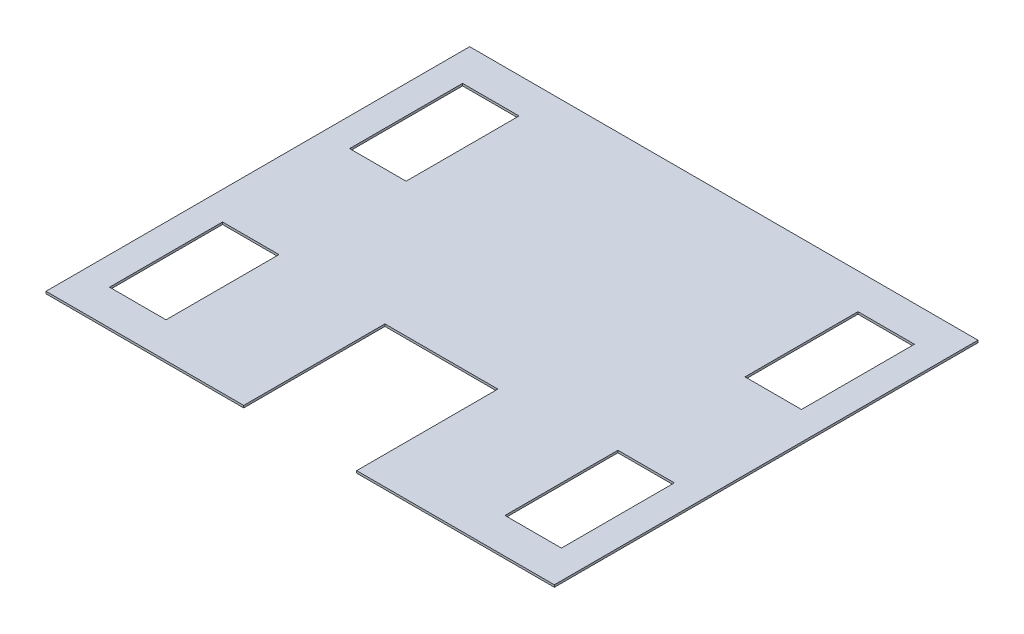
ISO-10303-21;
HEADER;
FILE_DESCRIPTION(('STEP AP214'),'2;1');
FILE_NAME('part.step','',(''),(''),'','','');
FILE_SCHEMA(('AUTOMOTIVE_DESIGN { 1 0 10303 214 1 1 1 1 }'));
ENDSEC;
DATA;
#1=APPLICATION_CONTEXT('core data for automotive mechanical design processes');
#2=APPLICATION_PROTOCOL_DEFINITION('international standard','automotive_design',2000,#1);
#3=PRODUCT_CONTEXT('',#1,'mechanical');
#4=PRODUCT('Part','Part','',(#3));
#5=PRODUCT_RELATED_PRODUCT_CATEGORY('part','',(#4));
#6=PRODUCT_DEFINITION_FORMATION('','',#4);
#7=PRODUCT_DEFINITION_CONTEXT('part definition',#1,'design');
#8=PRODUCT_DEFINITION('design','',#6,#7);
#9=PRODUCT_DEFINITION_SHAPE('','',#8);
#10=(LENGTH_UNIT() NAMED_UNIT(*) SI_UNIT(.MILLI.,.METRE.));
#11=(NAMED_UNIT(*) PLANE_ANGLE_UNIT() SI_UNIT($,.RADIAN.));
#12=(NAMED_UNIT(*) SI_UNIT($,.STERADIAN.) SOLID_ANGLE_UNIT());
#13=UNCERTAINTY_MEASURE_WITH_UNIT(LENGTH_MEASURE(1.E-05),#10,'distance_accuracy_value','');
#14=(GEOMETRIC_REPRESENTATION_CONTEXT(3) GLOBAL_UNCERTAINTY_ASSIGNED_CONTEXT((#13)) GLOBAL_UNIT_ASSIGNED_CONTEXT((#10,
#11,#12)) REPRESENTATION_CONTEXT('',''));
#15=CARTESIAN_POINT('',(0.,0.,0.));
#16=DIRECTION('',(0.,0.,1.));
#17=DIRECTION('',(1.,0.,0.));
#18=AXIS2_PLACEMENT_3D('',#15,#16,#17);
#19=CARTESIAN_POINT('',(-228.6,2.,190.5));
#20=DIRECTION('',(0.,0.,-1.));
#21=DIRECTION('',(-1.,0.,0.));
#22=AXIS2_PLACEMENT_3D('',#19,#20,#21);
#23=PLANE('',#22);
#24=DIRECTION('',(1.,0.,0.));
#25=VECTOR('',#24,1.);
#26=CARTESIAN_POINT('',(-228.6,0.,190.5));
#27=LINE('',#26,#25);
#28=CARTESIAN_POINT('',(-228.6,0.,190.5));
#29=VERTEX_POINT('',#28);
#30=CARTESIAN_POINT('',(-50.7999999999999,0.,190.5));
#31=VERTEX_POINT('',#30);
#32=EDGE_CURVE('E359',#29,#31,#27,.T.);
#33=ORIENTED_EDGE('',*,*,#32,.T.);
#34=DIRECTION('',(0.,1.,0.));
#35=VECTOR('',#34,1.);
#36=CARTESIAN_POINT('',(-50.7999999999999,0.,190.5));
#37=LINE('',#36,#35);
#38=CARTESIAN_POINT('',(-50.7999999999999,2.,190.5));
#39=VERTEX_POINT('',#38);
#40=EDGE_CURVE('E227',#31,#39,#37,.T.);
#41=ORIENTED_EDGE('',*,*,#40,.T.);
#42=DIRECTION('',(1.,0.,0.));
#43=VECTOR('',#42,1.);
#44=CARTESIAN_POINT('',(-228.6,2.,190.5));
#45=LINE('',#44,#43);
#46=CARTESIAN_POINT('',(-228.6,2.,190.5));
#47=VERTEX_POINT('',#46);
#48=EDGE_CURVE('E364',#47,#39,#45,.T.);
#49=ORIENTED_EDGE('',*,*,#48,.F.);
#50=DIRECTION('',(0.,-1.,0.));
#51=VECTOR('',#50,1.);
#52=CARTESIAN_POINT('',(-228.6,2.,190.5));
#53=LINE('',#52,#51);
#54=EDGE_CURVE('E378',#47,#29,#53,.T.);
#55=ORIENTED_EDGE('',*,*,#54,.T.);
#56=EDGE_LOOP('',(#33,#41,#49,#55));
#57=FACE_BOUND('',#56,.T.);
#58=ADVANCED_FACE('F34',(#57),#23,.F.);
#59=CARTESIAN_POINT('',(0.,2.,0.));
#60=DIRECTION('',(0.,1.,0.));
#61=DIRECTION('',(0.,0.,1.));
#62=AXIS2_PLACEMENT_3D('',#59,#60,#61);
#63=PLANE('',#62);
#64=DIRECTION('',(0.,0.,1.));
#65=VECTOR('',#64,1.);
#66=CARTESIAN_POINT('',(-50.7999999999999,2.,190.5));
#67=LINE('',#66,#65);
#68=CARTESIAN_POINT('',(-50.7999999999999,2.,63.5));
#69=VERTEX_POINT('',#68);
#70=EDGE_CURVE('E219',#69,#39,#67,.T.);
#71=ORIENTED_EDGE('',*,*,#70,.F.);
#72=DIRECTION('',(-1.,0.,0.));
#73=VECTOR('',#72,1.);
#74=CARTESIAN_POINT('',(-50.7999999999999,2.,63.5));
#75=LINE('',#74,#73);
#76=CARTESIAN_POINT('',(50.8000000000001,2.,63.5));
#77=VERTEX_POINT('',#76);
#78=EDGE_CURVE('E221',#77,#69,#75,.T.);
#79=ORIENTED_EDGE('',*,*,#78,.F.);
#80=DIRECTION('',(0.,0.,-1.));
#81=VECTOR('',#80,1.);
#82=CARTESIAN_POINT('',(50.8000000000001,2.,63.5));
#83=LINE('',#82,#81);
#84=CARTESIAN_POINT('',(50.8000000000001,2.,190.5));
#85=VERTEX_POINT('',#84);
#86=EDGE_CURVE('E199',#85,#77,#83,.T.);
#87=ORIENTED_EDGE('',*,*,#86,.F.);
#88=CARTESIAN_POINT('',(228.6,2.,190.5));
#89=VERTEX_POINT('',#88);
#90=EDGE_CURVE('E363',#85,#89,#45,.T.);
#91=ORIENTED_EDGE('',*,*,#90,.T.);
#92=DIRECTION('',(0.,0.,-1.));
#93=VECTOR('',#92,1.);
#94=CARTESIAN_POINT('',(228.6,2.,-190.5));
#95=LINE('',#94,#93);
#96=CARTESIAN_POINT('',(228.6,2.,-190.5));
#97=VERTEX_POINT('',#96);
#98=EDGE_CURVE('E355',#89,#97,#95,.T.);
#99=ORIENTED_EDGE('',*,*,#98,.T.);
#100=DIRECTION('',(-1.,0.,0.));
#101=VECTOR('',#100,1.);
#102=CARTESIAN_POINT('',(-228.6,2.,-190.5));
#103=LINE('',#102,#101);
#104=CARTESIAN_POINT('',(-228.6,2.,-190.5));
#105=VERTEX_POINT('',#104);
#106=EDGE_CURVE('E358',#97,#105,#103,.T.);
#107=ORIENTED_EDGE('',*,*,#106,.T.);
#108=DIRECTION('',(0.,0.,1.));
#109=VECTOR('',#108,1.);
#110=CARTESIAN_POINT('',(-228.6,2.,-190.5));
#111=LINE('',#110,#109);
#112=EDGE_CURVE('E361',#105,#47,#111,.T.);
#113=ORIENTED_EDGE('',*,*,#112,.T.);
#114=ORIENTED_EDGE('',*,*,#48,.T.);
#115=EDGE_LOOP('',(#71,#79,#87,#91,#99,#107,#113,#114));
#116=FACE_BOUND('',#115,.T.);
#117=DIRECTION('',(0.,0.,-1.));
#118=VECTOR('',#117,1.);
#119=CARTESIAN_POINT('',(203.2,2.,-57.1499999999999));
#120=LINE('',#119,#118);
#121=CARTESIAN_POINT('',(203.2,2.,-57.1499999999999));
#122=VERTEX_POINT('',#121);
#123=CARTESIAN_POINT('',(203.2,2.,-158.75));
#124=VERTEX_POINT('',#123);
#125=EDGE_CURVE('E237',#122,#124,#120,.T.);
#126=ORIENTED_EDGE('',*,*,#125,.F.);
#127=DIRECTION('',(1.,0.,0.));
#128=VECTOR('',#127,1.);
#129=CARTESIAN_POINT('',(152.4,2.,-57.15));
#130=LINE('',#129,#128);
#131=CARTESIAN_POINT('',(152.4,2.,-57.15));
#132=VERTEX_POINT('',#131);
#133=EDGE_CURVE('E276',#132,#122,#130,.T.);
#134=ORIENTED_EDGE('',*,*,#133,.F.);
#135=DIRECTION('',(0.,0.,1.));
#136=VECTOR('',#135,1.);
#137=CARTESIAN_POINT('',(152.4,2.,-158.75));
#138=LINE('',#137,#136);
#139=CARTESIAN_POINT('',(152.4,2.,-158.75));
#140=VERTEX_POINT('',#139);
#141=EDGE_CURVE('E279',#140,#132,#138,.T.);
#142=ORIENTED_EDGE('',*,*,#141,.F.);
#143=DIRECTION('',(-1.,0.,0.));
#144=VECTOR('',#143,1.);
#145=CARTESIAN_POINT('',(203.2,2.,-158.75));
#146=LINE('',#145,#144);
#147=EDGE_CURVE('E283',#124,#140,#146,.T.);
#148=ORIENTED_EDGE('',*,*,#147,.F.);
#149=EDGE_LOOP('',(#126,#134,#142,#148));
#150=FACE_BOUND('',#149,.T.);
#151=DIRECTION('',(0.,0.,1.));
#152=VECTOR('',#151,1.);
#153=CARTESIAN_POINT('',(-203.2,2.,57.15));
#154=LINE('',#153,#152);
#155=CARTESIAN_POINT('',(-203.2,2.,57.15));
#156=VERTEX_POINT('',#155);
#157=CARTESIAN_POINT('',(-203.2,2.,158.75));
#158=VERTEX_POINT('',#157);
#159=EDGE_CURVE('E258',#156,#158,#154,.T.);
#160=ORIENTED_EDGE('',*,*,#159,.F.);
#161=DIRECTION('',(-1.,0.,0.));
#162=VECTOR('',#161,1.);
#163=CARTESIAN_POINT('',(-152.4,2.,57.15));
#164=LINE('',#163,#162);
#165=CARTESIAN_POINT('',(-152.4,2.,57.15));
#166=VERTEX_POINT('',#165);
#167=EDGE_CURVE('E327',#166,#156,#164,.T.);
#168=ORIENTED_EDGE('',*,*,#167,.F.);
#169=DIRECTION('',(0.,0.,-1.));
#170=VECTOR('',#169,1.);
#171=CARTESIAN_POINT('',(-152.4,2.,158.75));
#172=LINE('',#171,#170);
#173=CARTESIAN_POINT('',(-152.4,2.,158.75));
#174=VERTEX_POINT('',#173);
#175=EDGE_CURVE('E341',#174,#166,#172,.T.);
#176=ORIENTED_EDGE('',*,*,#175,.F.);
#177=DIRECTION('',(1.,0.,0.));
#178=VECTOR('',#177,1.);
#179=CARTESIAN_POINT('',(-203.2,2.,158.75));
#180=LINE('',#179,#178);
#181=EDGE_CURVE('E338',#158,#174,#180,.T.);
#182=ORIENTED_EDGE('',*,*,#181,.F.);
#183=EDGE_LOOP('',(#160,#168,#176,#182));
#184=FACE_BOUND('',#183,.T.);
#185=DIRECTION('',(0.,0.,-1.));
#186=VECTOR('',#185,1.);
#187=CARTESIAN_POINT('',(-203.2,2.,-57.15));
#188=LINE('',#187,#186);
#189=CARTESIAN_POINT('',(-203.2,2.,-57.15));
#190=VERTEX_POINT('',#189);
#191=CARTESIAN_POINT('',(-203.2,2.,-158.75));
#192=VERTEX_POINT('',#191);
#193=EDGE_CURVE('E245',#190,#192,#188,.T.);
#194=ORIENTED_EDGE('',*,*,#193,.T.);
#195=DIRECTION('',(1.,0.,0.));
#196=VECTOR('',#195,1.);
#197=CARTESIAN_POINT('',(-203.2,2.,-158.75));
#198=LINE('',#197,#196);
#199=CARTESIAN_POINT('',(-152.4,2.,-158.75));
#200=VERTEX_POINT('',#199);
#201=EDGE_CURVE('E255',#192,#200,#198,.T.);
#202=ORIENTED_EDGE('',*,*,#201,.T.);
#203=DIRECTION('',(0.,0.,1.));
#204=VECTOR('',#203,1.);
#205=CARTESIAN_POINT('',(-152.4,2.,-158.75));
#206=LINE('',#205,#204);
#207=CARTESIAN_POINT('',(-152.4,2.,-57.15));
#208=VERTEX_POINT('',#207);
#209=EDGE_CURVE('E252',#200,#208,#206,.T.);
#210=ORIENTED_EDGE('',*,*,#209,.T.);
#211=DIRECTION('',(-1.,0.,0.));
#212=VECTOR('',#211,1.);
#213=CARTESIAN_POINT('',(-152.4,2.,-57.15));
#214=LINE('',#213,#212);
#215=EDGE_CURVE('E248',#208,#190,#214,.T.);
#216=ORIENTED_EDGE('',*,*,#215,.T.);
#217=EDGE_LOOP('',(#194,#202,#210,#216));
#218=FACE_BOUND('',#217,.T.);
#219=DIRECTION('',(0.,0.,-1.));
#220=VECTOR('',#219,1.);
#221=CARTESIAN_POINT('',(152.4,2.,158.75));
#222=LINE('',#221,#220);
#223=CARTESIAN_POINT('',(152.4,2.,158.75));
#224=VERTEX_POINT('',#223);
#225=CARTESIAN_POINT('',(152.4,2.,57.15));
#226=VERTEX_POINT('',#225);
#227=EDGE_CURVE('E305',#224,#226,#222,.T.);
#228=ORIENTED_EDGE('',*,*,#227,.T.);
#229=DIRECTION('',(1.,0.,0.));
#230=VECTOR('',#229,1.);
#231=CARTESIAN_POINT('',(152.4,2.,57.15));
#232=LINE('',#231,#230);
#233=CARTESIAN_POINT('',(203.2,2.,57.15));
#234=VERTEX_POINT('',#233);
#235=EDGE_CURVE('E57',#226,#234,#232,.T.);
#236=ORIENTED_EDGE('',*,*,#235,.T.);
#237=DIRECTION('',(0.,0.,1.));
#238=VECTOR('',#237,1.);
#239=CARTESIAN_POINT('',(203.2,2.,57.15));
#240=LINE('',#239,#238);
#241=CARTESIAN_POINT('',(203.2,2.,158.75));
#242=VERTEX_POINT('',#241);
#243=EDGE_CURVE('E312',#234,#242,#240,.T.);
#244=ORIENTED_EDGE('',*,*,#243,.T.);
#245=DIRECTION('',(-1.,0.,0.));
#246=VECTOR('',#245,1.);
#247=CARTESIAN_POINT('',(203.2,2.,158.75));
#248=LINE('',#247,#246);
#249=EDGE_CURVE('E308',#242,#224,#248,.T.);
#250=ORIENTED_EDGE('',*,*,#249,.T.);
#251=EDGE_LOOP('',(#228,#236,#244,#250));
#252=FACE_BOUND('',#251,.T.);
#253=ADVANCED_FACE('F393',(#116,#150,#184,#218,#252),#63,.T.);
#254=CARTESIAN_POINT('',(0.,0.,0.));
#255=DIRECTION('',(0.,1.,0.));
#256=DIRECTION('',(0.,0.,1.));
#257=AXIS2_PLACEMENT_3D('',#254,#255,#256);
#258=PLANE('',#257);
#259=DIRECTION('',(1.,0.,0.));
#260=VECTOR('',#259,1.);
#261=CARTESIAN_POINT('',(-203.2,0.,-158.75));
#262=LINE('',#261,#260);
#263=CARTESIAN_POINT('',(-203.2,0.,-158.75));
#264=VERTEX_POINT('',#263);
#265=CARTESIAN_POINT('',(-152.4,0.,-158.75));
#266=VERTEX_POINT('',#265);
#267=EDGE_CURVE('E249',#264,#266,#262,.T.);
#268=ORIENTED_EDGE('',*,*,#267,.F.);
#269=DIRECTION('',(0.,0.,-1.));
#270=VECTOR('',#269,1.);
#271=CARTESIAN_POINT('',(-203.2,0.,-57.15));
#272=LINE('',#271,#270);
#273=CARTESIAN_POINT('',(-203.2,0.,-57.15));
#274=VERTEX_POINT('',#273);
#275=EDGE_CURVE('E244',#274,#264,#272,.T.);
#276=ORIENTED_EDGE('',*,*,#275,.F.);
#277=DIRECTION('',(-1.,0.,0.));
#278=VECTOR('',#277,1.);
#279=CARTESIAN_POINT('',(-152.4,0.,-57.15));
#280=LINE('',#279,#278);
#281=CARTESIAN_POINT('',(-152.4,0.,-57.15));
#282=VERTEX_POINT('',#281);
#283=EDGE_CURVE('E260',#282,#274,#280,.T.);
#284=ORIENTED_EDGE('',*,*,#283,.F.);
#285=DIRECTION('',(0.,0.,1.));
#286=VECTOR('',#285,1.);
#287=CARTESIAN_POINT('',(-152.4,0.,-158.75));
#288=LINE('',#287,#286);
#289=EDGE_CURVE('E263',#266,#282,#288,.T.);
#290=ORIENTED_EDGE('',*,*,#289,.F.);
#291=EDGE_LOOP('',(#268,#276,#284,#290));
#292=FACE_BOUND('',#291,.T.);
#293=DIRECTION('',(-1.,0.,0.));
#294=VECTOR('',#293,1.);
#295=CARTESIAN_POINT('',(-152.4,0.,57.15));
#296=LINE('',#295,#294);
#297=CARTESIAN_POINT('',(-152.4,0.,57.15));
#298=VERTEX_POINT('',#297);
#299=CARTESIAN_POINT('',(-203.2,0.,57.15));
#300=VERTEX_POINT('',#299);
#301=EDGE_CURVE('E333',#298,#300,#296,.T.);
#302=ORIENTED_EDGE('',*,*,#301,.T.);
#303=DIRECTION('',(0.,0.,1.));
#304=VECTOR('',#303,1.);
#305=CARTESIAN_POINT('',(-203.2,0.,57.15));
#306=LINE('',#305,#304);
#307=CARTESIAN_POINT('',(-203.2,0.,158.75));
#308=VERTEX_POINT('',#307);
#309=EDGE_CURVE('E323',#300,#308,#306,.T.);
#310=ORIENTED_EDGE('',*,*,#309,.T.);
#311=DIRECTION('',(1.,0.,0.));
#312=VECTOR('',#311,1.);
#313=CARTESIAN_POINT('',(-203.2,0.,158.75));
#314=LINE('',#313,#312);
#315=CARTESIAN_POINT('',(-152.4,0.,158.75));
#316=VERTEX_POINT('',#315);
#317=EDGE_CURVE('E326',#308,#316,#314,.T.);
#318=ORIENTED_EDGE('',*,*,#317,.T.);
#319=DIRECTION('',(0.,0.,-1.));
#320=VECTOR('',#319,1.);
#321=CARTESIAN_POINT('',(-152.4,0.,158.75));
#322=LINE('',#321,#320);
#323=EDGE_CURVE('E330',#316,#298,#322,.T.);
#324=ORIENTED_EDGE('',*,*,#323,.T.);
#325=EDGE_LOOP('',(#302,#310,#318,#324));
#326=FACE_BOUND('',#325,.T.);
#327=DIRECTION('',(-1.,0.,0.));
#328=VECTOR('',#327,1.);
#329=CARTESIAN_POINT('',(-50.7999999999999,0.,63.5));
#330=LINE('',#329,#328);
#331=CARTESIAN_POINT('',(50.8000000000001,0.,63.5));
#332=VERTEX_POINT('',#331);
#333=CARTESIAN_POINT('',(-50.7999999999999,0.,63.5));
#334=VERTEX_POINT('',#333);
#335=EDGE_CURVE('E207',#332,#334,#330,.T.);
#336=ORIENTED_EDGE('',*,*,#335,.T.);
#337=DIRECTION('',(0.,0.,1.));
#338=VECTOR('',#337,1.);
#339=CARTESIAN_POINT('',(-50.7999999999999,0.,190.5));
#340=LINE('',#339,#338);
#341=EDGE_CURVE('E212',#334,#31,#340,.T.);
#342=ORIENTED_EDGE('',*,*,#341,.T.);
#343=ORIENTED_EDGE('',*,*,#32,.F.);
#344=DIRECTION('',(0.,0.,1.));
#345=VECTOR('',#344,1.);
#346=CARTESIAN_POINT('',(-228.6,0.,-190.5));
#347=LINE('',#346,#345);
#348=CARTESIAN_POINT('',(-228.6,0.,-190.5));
#349=VERTEX_POINT('',#348);
#350=EDGE_CURVE('E372',#349,#29,#347,.T.);
#351=ORIENTED_EDGE('',*,*,#350,.F.);
#352=DIRECTION('',(-1.,0.,0.));
#353=VECTOR('',#352,1.);
#354=CARTESIAN_POINT('',(-228.6,0.,-190.5));
#355=LINE('',#354,#353);
#356=CARTESIAN_POINT('',(228.6,0.,-190.5));
#357=VERTEX_POINT('',#356);
#358=EDGE_CURVE('E370',#357,#349,#355,.T.);
#359=ORIENTED_EDGE('',*,*,#358,.F.);
#360=DIRECTION('',(0.,0.,-1.));
#361=VECTOR('',#360,1.);
#362=CARTESIAN_POINT('',(228.6,0.,-190.5));
#363=LINE('',#362,#361);
#364=CARTESIAN_POINT('',(228.6,0.,190.5));
#365=VERTEX_POINT('',#364);
#366=EDGE_CURVE('E348',#365,#357,#363,.T.);
#367=ORIENTED_EDGE('',*,*,#366,.F.);
#368=CARTESIAN_POINT('',(50.8000000000001,0.,190.5));
#369=VERTEX_POINT('',#368);
#370=EDGE_CURVE('E218',#369,#365,#27,.T.);
#371=ORIENTED_EDGE('',*,*,#370,.F.);
#372=DIRECTION('',(0.,0.,-1.));
#373=VECTOR('',#372,1.);
#374=CARTESIAN_POINT('',(50.8000000000001,0.,63.5));
#375=LINE('',#374,#373);
#376=EDGE_CURVE('E49',#369,#332,#375,.T.);
#377=ORIENTED_EDGE('',*,*,#376,.T.);
#378=EDGE_LOOP('',(#336,#342,#343,#351,#359,#367,#371,#377));
#379=FACE_BOUND('',#378,.T.);
#380=DIRECTION('',(1.,0.,0.));
#381=VECTOR('',#380,1.);
#382=CARTESIAN_POINT('',(152.4,0.,-57.15));
#383=LINE('',#382,#381);
#384=CARTESIAN_POINT('',(152.4,0.,-57.15));
#385=VERTEX_POINT('',#384);
#386=CARTESIAN_POINT('',(203.2,0.,-57.1499999999999));
#387=VERTEX_POINT('',#386);
#388=EDGE_CURVE('E269',#385,#387,#383,.T.);
#389=ORIENTED_EDGE('',*,*,#388,.T.);
#390=DIRECTION('',(0.,0.,-1.));
#391=VECTOR('',#390,1.);
#392=CARTESIAN_POINT('',(203.2,0.,-57.1499999999999));
#393=LINE('',#392,#391);
#394=CARTESIAN_POINT('',(203.2,0.,-158.75));
#395=VERTEX_POINT('',#394);
#396=EDGE_CURVE('E280',#387,#395,#393,.T.);
#397=ORIENTED_EDGE('',*,*,#396,.T.);
#398=DIRECTION('',(-1.,0.,0.));
#399=VECTOR('',#398,1.);
#400=CARTESIAN_POINT('',(203.2,0.,-158.75));
#401=LINE('',#400,#399);
#402=CARTESIAN_POINT('',(152.4,0.,-158.75));
#403=VERTEX_POINT('',#402);
#404=EDGE_CURVE('E292',#395,#403,#401,.T.);
#405=ORIENTED_EDGE('',*,*,#404,.T.);
#406=DIRECTION('',(0.,0.,1.));
#407=VECTOR('',#406,1.);
#408=CARTESIAN_POINT('',(152.4,0.,-158.75));
#409=LINE('',#408,#407);
#410=EDGE_CURVE('E289',#403,#385,#409,.T.);
#411=ORIENTED_EDGE('',*,*,#410,.T.);
#412=EDGE_LOOP('',(#389,#397,#405,#411));
#413=FACE_BOUND('',#412,.T.);
#414=DIRECTION('',(1.,0.,0.));
#415=VECTOR('',#414,1.);
#416=CARTESIAN_POINT('',(152.4,0.,57.15));
#417=LINE('',#416,#415);
#418=CARTESIAN_POINT('',(152.4,0.,57.15));
#419=VERTEX_POINT('',#418);
#420=CARTESIAN_POINT('',(203.2,0.,57.15));
#421=VERTEX_POINT('',#420);
#422=EDGE_CURVE('E309',#419,#421,#417,.T.);
#423=ORIENTED_EDGE('',*,*,#422,.F.);
#424=DIRECTION('',(0.,0.,-1.));
#425=VECTOR('',#424,1.);
#426=CARTESIAN_POINT('',(152.4,0.,158.75));
#427=LINE('',#426,#425);
#428=CARTESIAN_POINT('',(152.4,0.,158.75));
#429=VERTEX_POINT('',#428);
#430=EDGE_CURVE('E304',#429,#419,#427,.T.);
#431=ORIENTED_EDGE('',*,*,#430,.F.);
#432=DIRECTION('',(-1.,0.,0.));
#433=VECTOR('',#432,1.);
#434=CARTESIAN_POINT('',(203.2,0.,158.75));
#435=LINE('',#434,#433);
#436=CARTESIAN_POINT('',(203.2,0.,158.75));
#437=VERTEX_POINT('',#436);
#438=EDGE_CURVE('E317',#437,#429,#435,.T.);
#439=ORIENTED_EDGE('',*,*,#438,.F.);
#440=DIRECTION('',(0.,0.,1.));
#441=VECTOR('',#440,1.);
#442=CARTESIAN_POINT('',(203.2,0.,57.15));
#443=LINE('',#442,#441);
#444=EDGE_CURVE('E320',#421,#437,#443,.T.);
#445=ORIENTED_EDGE('',*,*,#444,.F.);
#446=EDGE_LOOP('',(#423,#431,#439,#445));
#447=FACE_BOUND('',#446,.T.);
#448=ADVANCED_FACE('F215',(#292,#326,#379,#413,#447),#258,.F.);
#449=CARTESIAN_POINT('',(228.6,2.,-190.5));
#450=DIRECTION('',(-1.,0.,0.));
#451=DIRECTION('',(0.,0.,1.));
#452=AXIS2_PLACEMENT_3D('',#449,#450,#451);
#453=PLANE('',#452);
#454=ORIENTED_EDGE('',*,*,#366,.T.);
#455=DIRECTION('',(0.,-1.,0.));
#456=VECTOR('',#455,1.);
#457=CARTESIAN_POINT('',(228.6,2.,-190.5));
#458=LINE('',#457,#456);
#459=EDGE_CURVE('E11',#97,#357,#458,.T.);
#460=ORIENTED_EDGE('',*,*,#459,.F.);
#461=ORIENTED_EDGE('',*,*,#98,.F.);
#462=DIRECTION('',(0.,-1.,0.));
#463=VECTOR('',#462,1.);
#464=CARTESIAN_POINT('',(228.6,2.,190.5));
#465=LINE('',#464,#463);
#466=EDGE_CURVE('E367',#89,#365,#465,.T.);
#467=ORIENTED_EDGE('',*,*,#466,.T.);
#468=EDGE_LOOP('',(#454,#460,#461,#467));
#469=FACE_BOUND('',#468,.T.);
#470=ADVANCED_FACE('F36',(#469),#453,.F.);
#471=CARTESIAN_POINT('',(-228.6,2.,-190.5));
#472=DIRECTION('',(0.,0.,1.));
#473=DIRECTION('',(1.,0.,0.));
#474=AXIS2_PLACEMENT_3D('',#471,#472,#473);
#475=PLANE('',#474);
#476=ORIENTED_EDGE('',*,*,#358,.T.);
#477=DIRECTION('',(0.,-1.,0.));
#478=VECTOR('',#477,1.);
#479=CARTESIAN_POINT('',(-228.6,2.,-190.5));
#480=LINE('',#479,#478);
#481=EDGE_CURVE('E42',#105,#349,#480,.T.);
#482=ORIENTED_EDGE('',*,*,#481,.F.);
#483=ORIENTED_EDGE('',*,*,#106,.F.);
#484=ORIENTED_EDGE('',*,*,#459,.T.);
#485=EDGE_LOOP('',(#476,#482,#483,#484));
#486=FACE_BOUND('',#485,.T.);
#487=ADVANCED_FACE('F397',(#486),#475,.F.);
#488=CARTESIAN_POINT('',(-228.6,2.,-190.5));
#489=DIRECTION('',(1.,0.,0.));
#490=DIRECTION('',(0.,0.,-1.));
#491=AXIS2_PLACEMENT_3D('',#488,#489,#490);
#492=PLANE('',#491);
#493=ORIENTED_EDGE('',*,*,#350,.T.);
#494=ORIENTED_EDGE('',*,*,#54,.F.);
#495=ORIENTED_EDGE('',*,*,#112,.F.);
#496=ORIENTED_EDGE('',*,*,#481,.T.);
#497=EDGE_LOOP('',(#493,#494,#495,#496));
#498=FACE_BOUND('',#497,.T.);
#499=ADVANCED_FACE('F385',(#498),#492,.F.);
#500=ORIENTED_EDGE('',*,*,#90,.F.);
#501=DIRECTION('',(0.,1.,0.));
#502=VECTOR('',#501,1.);
#503=CARTESIAN_POINT('',(50.8000000000001,0.,190.5));
#504=LINE('',#503,#502);
#505=EDGE_CURVE('E204',#369,#85,#504,.T.);
#506=ORIENTED_EDGE('',*,*,#505,.F.);
#507=ORIENTED_EDGE('',*,*,#370,.T.);
#508=ORIENTED_EDGE('',*,*,#466,.F.);
#509=EDGE_LOOP('',(#500,#506,#507,#508));
#510=FACE_BOUND('',#509,.T.);
#511=ADVANCED_FACE('F402',(#510),#23,.F.);
#512=CARTESIAN_POINT('',(-203.2,0.,57.15));
#513=DIRECTION('',(-1.,0.,0.));
#514=DIRECTION('',(0.,0.,1.));
#515=AXIS2_PLACEMENT_3D('',#512,#513,#514);
#516=PLANE('',#515);
#517=ORIENTED_EDGE('',*,*,#159,.T.);
#518=DIRECTION('',(0.,1.,0.));
#519=VECTOR('',#518,1.);
#520=CARTESIAN_POINT('',(-203.2,0.,158.75));
#521=LINE('',#520,#519);
#522=EDGE_CURVE('E336',#308,#158,#521,.T.);
#523=ORIENTED_EDGE('',*,*,#522,.F.);
#524=ORIENTED_EDGE('',*,*,#309,.F.);
#525=DIRECTION('',(0.,1.,0.));
#526=VECTOR('',#525,1.);
#527=CARTESIAN_POINT('',(-203.2,0.,57.15));
#528=LINE('',#527,#526);
#529=EDGE_CURVE('E346',#300,#156,#528,.T.);
#530=ORIENTED_EDGE('',*,*,#529,.T.);
#531=EDGE_LOOP('',(#517,#523,#524,#530));
#532=FACE_BOUND('',#531,.T.);
#533=ADVANCED_FACE('F404',(#532),#516,.F.);
#534=CARTESIAN_POINT('',(-152.4,0.,57.15));
#535=DIRECTION('',(0.,0.,-1.));
#536=DIRECTION('',(-1.,0.,0.));
#537=AXIS2_PLACEMENT_3D('',#534,#535,#536);
#538=PLANE('',#537);
#539=ORIENTED_EDGE('',*,*,#167,.T.);
#540=ORIENTED_EDGE('',*,*,#529,.F.);
#541=ORIENTED_EDGE('',*,*,#301,.F.);
#542=DIRECTION('',(0.,1.,0.));
#543=VECTOR('',#542,1.);
#544=CARTESIAN_POINT('',(-152.4,0.,57.15));
#545=LINE('',#544,#543);
#546=EDGE_CURVE('E349',#298,#166,#545,.T.);
#547=ORIENTED_EDGE('',*,*,#546,.T.);
#548=EDGE_LOOP('',(#539,#540,#541,#547));
#549=FACE_BOUND('',#548,.T.);
#550=ADVANCED_FACE('F410',(#549),#538,.F.);
#551=CARTESIAN_POINT('',(-152.4,0.,158.75));
#552=DIRECTION('',(1.,0.,0.));
#553=DIRECTION('',(0.,0.,-1.));
#554=AXIS2_PLACEMENT_3D('',#551,#552,#553);
#555=PLANE('',#554);
#556=ORIENTED_EDGE('',*,*,#175,.T.);
#557=ORIENTED_EDGE('',*,*,#546,.F.);
#558=ORIENTED_EDGE('',*,*,#323,.F.);
#559=DIRECTION('',(0.,1.,0.));
#560=VECTOR('',#559,1.);
#561=CARTESIAN_POINT('',(-152.4,0.,158.75));
#562=LINE('',#561,#560);
#563=EDGE_CURVE('E351',#316,#174,#562,.T.);
#564=ORIENTED_EDGE('',*,*,#563,.T.);
#565=EDGE_LOOP('',(#556,#557,#558,#564));
#566=FACE_BOUND('',#565,.T.);
#567=ADVANCED_FACE('F429',(#566),#555,.F.);
#568=CARTESIAN_POINT('',(-203.2,0.,158.75));
#569=DIRECTION('',(0.,0.,1.));
#570=DIRECTION('',(1.,0.,0.));
#571=AXIS2_PLACEMENT_3D('',#568,#569,#570);
#572=PLANE('',#571);
#573=ORIENTED_EDGE('',*,*,#181,.T.);
#574=ORIENTED_EDGE('',*,*,#563,.F.);
#575=ORIENTED_EDGE('',*,*,#317,.F.);
#576=ORIENTED_EDGE('',*,*,#522,.T.);
#577=EDGE_LOOP('',(#573,#574,#575,#576));
#578=FACE_BOUND('',#577,.T.);
#579=ADVANCED_FACE('F425',(#578),#572,.F.);
#580=CARTESIAN_POINT('',(-203.2,0.,-158.75));
#581=DIRECTION('',(0.,0.,1.));
#582=DIRECTION('',(1.,0.,0.));
#583=AXIS2_PLACEMENT_3D('',#580,#581,#582);
#584=PLANE('',#583);
#585=ORIENTED_EDGE('',*,*,#201,.F.);
#586=DIRECTION('',(0.,1.,0.));
#587=VECTOR('',#586,1.);
#588=CARTESIAN_POINT('',(-203.2,0.,-158.75));
#589=LINE('',#588,#587);
#590=EDGE_CURVE('E241',#264,#192,#589,.T.);
#591=ORIENTED_EDGE('',*,*,#590,.F.);
#592=ORIENTED_EDGE('',*,*,#267,.T.);
#593=DIRECTION('',(0.,1.,0.));
#594=VECTOR('',#593,1.);
#595=CARTESIAN_POINT('',(-152.4,0.,-158.75));
#596=LINE('',#595,#594);
#597=EDGE_CURVE('E233',#266,#200,#596,.T.);
#598=ORIENTED_EDGE('',*,*,#597,.T.);
#599=EDGE_LOOP('',(#585,#591,#592,#598));
#600=FACE_BOUND('',#599,.T.);
#601=ADVANCED_FACE('F428',(#600),#584,.T.);
#602=CARTESIAN_POINT('',(-152.4,0.,-158.75));
#603=DIRECTION('',(-1.,0.,0.));
#604=DIRECTION('',(0.,0.,1.));
#605=AXIS2_PLACEMENT_3D('',#602,#603,#604);
#606=PLANE('',#605);
#607=ORIENTED_EDGE('',*,*,#209,.F.);
#608=ORIENTED_EDGE('',*,*,#597,.F.);
#609=ORIENTED_EDGE('',*,*,#289,.T.);
#610=DIRECTION('',(0.,1.,0.));
#611=VECTOR('',#610,1.);
#612=CARTESIAN_POINT('',(-152.4,0.,-57.15));
#613=LINE('',#612,#611);
#614=EDGE_CURVE('E236',#282,#208,#613,.T.);
#615=ORIENTED_EDGE('',*,*,#614,.T.);
#616=EDGE_LOOP('',(#607,#608,#609,#615));
#617=FACE_BOUND('',#616,.T.);
#618=ADVANCED_FACE('F476',(#617),#606,.T.);
#619=CARTESIAN_POINT('',(-152.4,0.,-57.15));
#620=DIRECTION('',(0.,0.,-1.));
#621=DIRECTION('',(-1.,0.,0.));
#622=AXIS2_PLACEMENT_3D('',#619,#620,#621);
#623=PLANE('',#622);
#624=ORIENTED_EDGE('',*,*,#215,.F.);
#625=ORIENTED_EDGE('',*,*,#614,.F.);
#626=ORIENTED_EDGE('',*,*,#283,.T.);
#627=DIRECTION('',(0.,1.,0.));
#628=VECTOR('',#627,1.);
#629=CARTESIAN_POINT('',(-203.2,0.,-57.15));
#630=LINE('',#629,#628);
#631=EDGE_CURVE('E239',#274,#190,#630,.T.);
#632=ORIENTED_EDGE('',*,*,#631,.T.);
#633=EDGE_LOOP('',(#624,#625,#626,#632));
#634=FACE_BOUND('',#633,.T.);
#635=ADVANCED_FACE('F472',(#634),#623,.T.);
#636=CARTESIAN_POINT('',(-203.2,0.,-57.15));
#637=DIRECTION('',(1.,0.,0.));
#638=DIRECTION('',(0.,0.,-1.));
#639=AXIS2_PLACEMENT_3D('',#636,#637,#638);
#640=PLANE('',#639);
#641=ORIENTED_EDGE('',*,*,#193,.F.);
#642=ORIENTED_EDGE('',*,*,#631,.F.);
#643=ORIENTED_EDGE('',*,*,#275,.T.);
#644=ORIENTED_EDGE('',*,*,#590,.T.);
#645=EDGE_LOOP('',(#641,#642,#643,#644));
#646=FACE_BOUND('',#645,.T.);
#647=ADVANCED_FACE('F468',(#646),#640,.T.);
#648=CARTESIAN_POINT('',(203.2,0.,-57.1499999999999));
#649=DIRECTION('',(1.,0.,0.));
#650=DIRECTION('',(0.,0.,-1.));
#651=AXIS2_PLACEMENT_3D('',#648,#649,#650);
#652=PLANE('',#651);
#653=ORIENTED_EDGE('',*,*,#125,.T.);
#654=DIRECTION('',(0.,1.,0.));
#655=VECTOR('',#654,1.);
#656=CARTESIAN_POINT('',(203.2,0.,-158.75));
#657=LINE('',#656,#655);
#658=EDGE_CURVE('E266',#395,#124,#657,.T.);
#659=ORIENTED_EDGE('',*,*,#658,.F.);
#660=ORIENTED_EDGE('',*,*,#396,.F.);
#661=DIRECTION('',(0.,1.,0.));
#662=VECTOR('',#661,1.);
#663=CARTESIAN_POINT('',(203.2,0.,-57.1499999999999));
#664=LINE('',#663,#662);
#665=EDGE_CURVE('E274',#387,#122,#664,.T.);
#666=ORIENTED_EDGE('',*,*,#665,.T.);
#667=EDGE_LOOP('',(#653,#659,#660,#666));
#668=FACE_BOUND('',#667,.T.);
#669=ADVANCED_FACE('F458',(#668),#652,.F.);
#670=CARTESIAN_POINT('',(152.4,0.,-57.15));
#671=DIRECTION('',(0.,0.,1.));
#672=DIRECTION('',(1.,0.,0.));
#673=AXIS2_PLACEMENT_3D('',#670,#671,#672);
#674=PLANE('',#673);
#675=ORIENTED_EDGE('',*,*,#133,.T.);
#676=ORIENTED_EDGE('',*,*,#665,.F.);
#677=ORIENTED_EDGE('',*,*,#388,.F.);
#678=DIRECTION('',(0.,1.,0.));
#679=VECTOR('',#678,1.);
#680=CARTESIAN_POINT('',(152.4,0.,-57.15));
#681=LINE('',#680,#679);
#682=EDGE_CURVE('E272',#385,#132,#681,.T.);
#683=ORIENTED_EDGE('',*,*,#682,.T.);
#684=EDGE_LOOP('',(#675,#676,#677,#683));
#685=FACE_BOUND('',#684,.T.);
#686=ADVANCED_FACE('F454',(#685),#674,.F.);
#687=CARTESIAN_POINT('',(152.4,0.,-158.75));
#688=DIRECTION('',(-1.,0.,0.));
#689=DIRECTION('',(0.,0.,1.));
#690=AXIS2_PLACEMENT_3D('',#687,#688,#689);
#691=PLANE('',#690);
#692=ORIENTED_EDGE('',*,*,#141,.T.);
#693=ORIENTED_EDGE('',*,*,#682,.F.);
#694=ORIENTED_EDGE('',*,*,#410,.F.);
#695=DIRECTION('',(0.,1.,0.));
#696=VECTOR('',#695,1.);
#697=CARTESIAN_POINT('',(152.4,0.,-158.75));
#698=LINE('',#697,#696);
#699=EDGE_CURVE('E270',#403,#140,#698,.T.);
#700=ORIENTED_EDGE('',*,*,#699,.T.);
#701=EDGE_LOOP('',(#692,#693,#694,#700));
#702=FACE_BOUND('',#701,.T.);
#703=ADVANCED_FACE('F457',(#702),#691,.F.);
#704=CARTESIAN_POINT('',(203.2,0.,-158.75));
#705=DIRECTION('',(0.,0.,-1.));
#706=DIRECTION('',(-1.,0.,0.));
#707=AXIS2_PLACEMENT_3D('',#704,#705,#706);
#708=PLANE('',#707);
#709=ORIENTED_EDGE('',*,*,#147,.T.);
#710=ORIENTED_EDGE('',*,*,#699,.F.);
#711=ORIENTED_EDGE('',*,*,#404,.F.);
#712=ORIENTED_EDGE('',*,*,#658,.T.);
#713=EDGE_LOOP('',(#709,#710,#711,#712));
#714=FACE_BOUND('',#713,.T.);
#715=ADVANCED_FACE('F453',(#714),#708,.F.);
#716=CARTESIAN_POINT('',(152.4,0.,57.15));
#717=DIRECTION('',(0.,0.,1.));
#718=DIRECTION('',(1.,0.,0.));
#719=AXIS2_PLACEMENT_3D('',#716,#717,#718);
#720=PLANE('',#719);
#721=ORIENTED_EDGE('',*,*,#235,.F.);
#722=DIRECTION('',(0.,1.,0.));
#723=VECTOR('',#722,1.);
#724=CARTESIAN_POINT('',(152.4,0.,57.15));
#725=LINE('',#724,#723);
#726=EDGE_CURVE('E302',#419,#226,#725,.T.);
#727=ORIENTED_EDGE('',*,*,#726,.F.);
#728=ORIENTED_EDGE('',*,*,#422,.T.);
#729=DIRECTION('',(0.,1.,0.));
#730=VECTOR('',#729,1.);
#731=CARTESIAN_POINT('',(203.2,0.,57.15));
#732=LINE('',#731,#730);
#733=EDGE_CURVE('E230',#421,#234,#732,.T.);
#734=ORIENTED_EDGE('',*,*,#733,.T.);
#735=EDGE_LOOP('',(#721,#727,#728,#734));
#736=FACE_BOUND('',#735,.T.);
#737=ADVANCED_FACE('F449',(#736),#720,.T.);
#738=CARTESIAN_POINT('',(203.2,0.,57.15));
#739=DIRECTION('',(-1.,0.,0.));
#740=DIRECTION('',(0.,0.,1.));
#741=AXIS2_PLACEMENT_3D('',#738,#739,#740);
#742=PLANE('',#741);
#743=ORIENTED_EDGE('',*,*,#243,.F.);
#744=ORIENTED_EDGE('',*,*,#733,.F.);
#745=ORIENTED_EDGE('',*,*,#444,.T.);
#746=DIRECTION('',(0.,1.,0.));
#747=VECTOR('',#746,1.);
#748=CARTESIAN_POINT('',(203.2,0.,158.75));
#749=LINE('',#748,#747);
#750=EDGE_CURVE('E298',#437,#242,#749,.T.);
#751=ORIENTED_EDGE('',*,*,#750,.T.);
#752=EDGE_LOOP('',(#743,#744,#745,#751));
#753=FACE_BOUND('',#752,.T.);
#754=ADVANCED_FACE('F445',(#753),#742,.T.);
#755=CARTESIAN_POINT('',(203.2,0.,158.75));
#756=DIRECTION('',(0.,0.,-1.));
#757=DIRECTION('',(-1.,0.,0.));
#758=AXIS2_PLACEMENT_3D('',#755,#756,#757);
#759=PLANE('',#758);
#760=ORIENTED_EDGE('',*,*,#249,.F.);
#761=ORIENTED_EDGE('',*,*,#750,.F.);
#762=ORIENTED_EDGE('',*,*,#438,.T.);
#763=DIRECTION('',(0.,1.,0.));
#764=VECTOR('',#763,1.);
#765=CARTESIAN_POINT('',(152.4,0.,158.75));
#766=LINE('',#765,#764);
#767=EDGE_CURVE('E300',#429,#224,#766,.T.);
#768=ORIENTED_EDGE('',*,*,#767,.T.);
#769=EDGE_LOOP('',(#760,#761,#762,#768));
#770=FACE_BOUND('',#769,.T.);
#771=ADVANCED_FACE('F441',(#770),#759,.T.);
#772=CARTESIAN_POINT('',(152.4,0.,158.75));
#773=DIRECTION('',(1.,0.,0.));
#774=DIRECTION('',(0.,0.,-1.));
#775=AXIS2_PLACEMENT_3D('',#772,#773,#774);
#776=PLANE('',#775);
#777=ORIENTED_EDGE('',*,*,#227,.F.);
#778=ORIENTED_EDGE('',*,*,#767,.F.);
#779=ORIENTED_EDGE('',*,*,#430,.T.);
#780=ORIENTED_EDGE('',*,*,#726,.T.);
#781=EDGE_LOOP('',(#777,#778,#779,#780));
#782=FACE_BOUND('',#781,.T.);
#783=ADVANCED_FACE('F437',(#782),#776,.T.);
#784=CARTESIAN_POINT('',(-50.7999999999999,0.,190.5));
#785=DIRECTION('',(-1.,0.,0.));
#786=DIRECTION('',(0.,0.,1.));
#787=AXIS2_PLACEMENT_3D('',#784,#785,#786);
#788=PLANE('',#787);
#789=ORIENTED_EDGE('',*,*,#70,.T.);
#790=ORIENTED_EDGE('',*,*,#40,.F.);
#791=ORIENTED_EDGE('',*,*,#341,.F.);
#792=DIRECTION('',(0.,1.,0.));
#793=VECTOR('',#792,1.);
#794=CARTESIAN_POINT('',(-50.7999999999999,0.,63.5));
#795=LINE('',#794,#793);
#796=EDGE_CURVE('E203',#334,#69,#795,.T.);
#797=ORIENTED_EDGE('',*,*,#796,.T.);
#798=EDGE_LOOP('',(#789,#790,#791,#797));
#799=FACE_BOUND('',#798,.T.);
#800=ADVANCED_FACE('F440',(#799),#788,.F.);
#801=CARTESIAN_POINT('',(-50.7999999999999,0.,63.5));
#802=DIRECTION('',(0.,0.,-1.));
#803=DIRECTION('',(-1.,0.,0.));
#804=AXIS2_PLACEMENT_3D('',#801,#802,#803);
#805=PLANE('',#804);
#806=ORIENTED_EDGE('',*,*,#78,.T.);
#807=ORIENTED_EDGE('',*,*,#796,.F.);
#808=ORIENTED_EDGE('',*,*,#335,.F.);
#809=DIRECTION('',(0.,1.,0.));
#810=VECTOR('',#809,1.);
#811=CARTESIAN_POINT('',(50.8000000000001,0.,63.5));
#812=LINE('',#811,#810);
#813=EDGE_CURVE('E195',#332,#77,#812,.T.);
#814=ORIENTED_EDGE('',*,*,#813,.T.);
#815=EDGE_LOOP('',(#806,#807,#808,#814));
#816=FACE_BOUND('',#815,.T.);
#817=ADVANCED_FACE('F208',(#816),#805,.F.);
#818=CARTESIAN_POINT('',(50.8000000000001,0.,63.5));
#819=DIRECTION('',(1.,0.,0.));
#820=DIRECTION('',(0.,0.,-1.));
#821=AXIS2_PLACEMENT_3D('',#818,#819,#820);
#822=PLANE('',#821);
#823=ORIENTED_EDGE('',*,*,#86,.T.);
#824=ORIENTED_EDGE('',*,*,#813,.F.);
#825=ORIENTED_EDGE('',*,*,#376,.F.);
#826=ORIENTED_EDGE('',*,*,#505,.T.);
#827=EDGE_LOOP('',(#823,#824,#825,#826));
#828=FACE_BOUND('',#827,.T.);
#829=ADVANCED_FACE('F197',(#828),#822,.F.);
#830=CLOSED_SHELL('',(#58,#253,#448,#470,#487,#499,#511,#533,#550,#567,#579,#601,#618,#635,#647,
#669,#686,#703,#715,#737,#754,#771,#783,#800,#817,#829));
#831=MANIFOLD_SOLID_BREP('B2',#830);
#832=ADVANCED_BREP_SHAPE_REPRESENTATION('',(#18,#831),#14);
#833=SHAPE_DEFINITION_REPRESENTATION(#9,#832);
ENDSEC;
END-ISO-10303-21;
